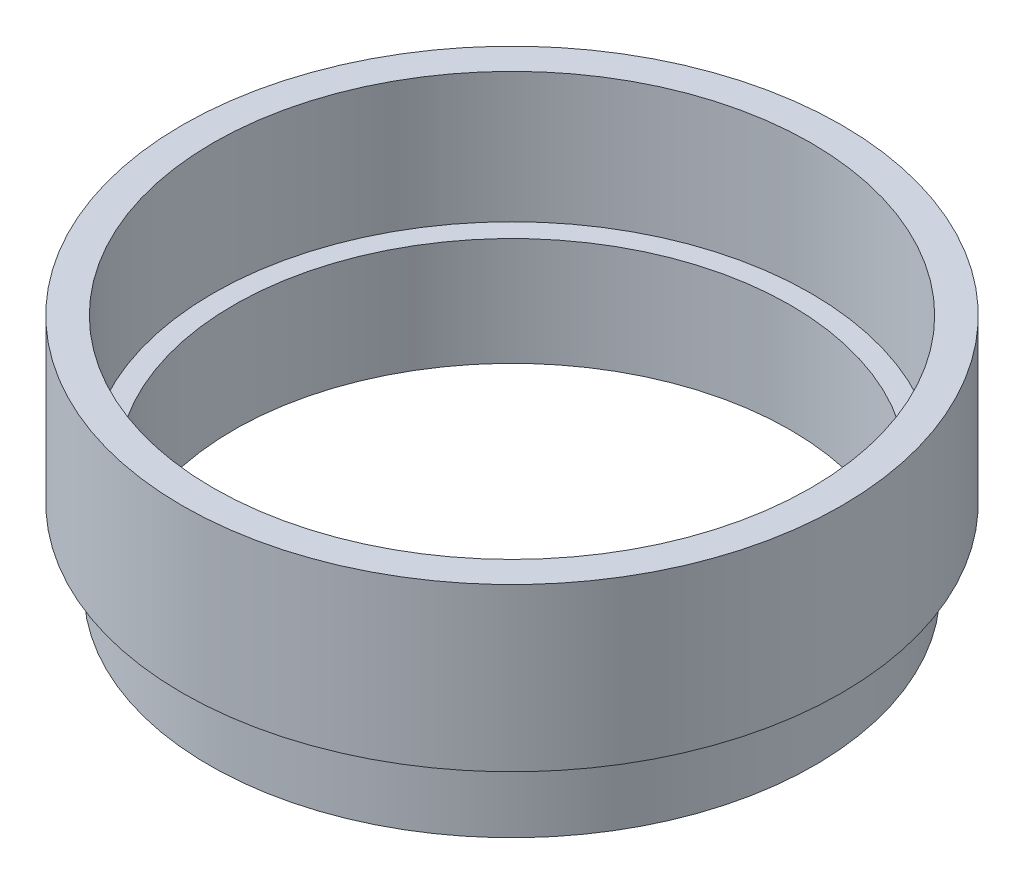
ISO-10303-21;
HEADER;
FILE_DESCRIPTION(('STEP AP214'),'2;1');
FILE_NAME('part.step','',(''),(''),'','','');
FILE_SCHEMA(('AUTOMOTIVE_DESIGN { 1 0 10303 214 1 1 1 1 }'));
ENDSEC;
DATA;
#1=APPLICATION_CONTEXT('core data for automotive mechanical design processes');
#2=APPLICATION_PROTOCOL_DEFINITION('international standard','automotive_design',2000,#1);
#3=PRODUCT_CONTEXT('',#1,'mechanical');
#4=PRODUCT('Part','Part','',(#3));
#5=PRODUCT_RELATED_PRODUCT_CATEGORY('part','',(#4));
#6=PRODUCT_DEFINITION_FORMATION('','',#4);
#7=PRODUCT_DEFINITION_CONTEXT('part definition',#1,'design');
#8=PRODUCT_DEFINITION('design','',#6,#7);
#9=PRODUCT_DEFINITION_SHAPE('','',#8);
#10=(LENGTH_UNIT() NAMED_UNIT(*) SI_UNIT(.MILLI.,.METRE.));
#11=(NAMED_UNIT(*) PLANE_ANGLE_UNIT() SI_UNIT($,.RADIAN.));
#12=(NAMED_UNIT(*) SI_UNIT($,.STERADIAN.) SOLID_ANGLE_UNIT());
#13=UNCERTAINTY_MEASURE_WITH_UNIT(LENGTH_MEASURE(1.E-05),#10,'distance_accuracy_value','');
#14=(GEOMETRIC_REPRESENTATION_CONTEXT(3) GLOBAL_UNCERTAINTY_ASSIGNED_CONTEXT((#13)) GLOBAL_UNIT_ASSIGNED_CONTEXT((#10,
#11,#12)) REPRESENTATION_CONTEXT('',''));
#15=CARTESIAN_POINT('',(0.,0.,0.));
#16=DIRECTION('',(0.,0.,1.));
#17=DIRECTION('',(1.,0.,0.));
#18=AXIS2_PLACEMENT_3D('',#15,#16,#17);
#19=CARTESIAN_POINT('',(0.,0.,0.));
#20=DIRECTION('',(0.,-1.,0.));
#21=DIRECTION('',(0.,0.,-1.));
#22=AXIS2_PLACEMENT_3D('',#19,#20,#21);
#23=CYLINDRICAL_SURFACE('',#22,13.081);
#24=CARTESIAN_POINT('',(0.,5.08,0.));
#25=DIRECTION('',(0.,-1.,0.));
#26=DIRECTION('',(0.,0.,-1.));
#27=AXIS2_PLACEMENT_3D('',#24,#25,#26);
#28=CIRCLE('',#27,13.081);
#29=CARTESIAN_POINT('',(0.,5.08,-13.081));
#30=VERTEX_POINT('',#29);
#31=EDGE_CURVE('E59',#30,#30,#28,.T.);
#32=ORIENTED_EDGE('',*,*,#31,.F.);
#33=EDGE_LOOP('',(#32));
#34=FACE_BOUND('',#33,.T.);
#35=CARTESIAN_POINT('',(0.,0.,0.));
#36=DIRECTION('',(0.,-1.,0.));
#37=DIRECTION('',(0.,0.,-1.));
#38=AXIS2_PLACEMENT_3D('',#35,#36,#37);
#39=CIRCLE('',#38,13.081);
#40=CARTESIAN_POINT('',(0.,0.,-13.081));
#41=VERTEX_POINT('',#40);
#42=EDGE_CURVE('E10',#41,#41,#39,.T.);
#43=ORIENTED_EDGE('',*,*,#42,.T.);
#44=EDGE_LOOP('',(#43));
#45=FACE_BOUND('',#44,.T.);
#46=ADVANCED_FACE('F31',(#34,#45),#23,.F.);
#47=CARTESIAN_POINT('',(-13.081,0.,0.));
#48=DIRECTION('',(0.,1.,0.));
#49=DIRECTION('',(0.,0.,1.));
#50=AXIS2_PLACEMENT_3D('',#47,#48,#49);
#51=PLANE('',#50);
#52=ORIENTED_EDGE('',*,*,#42,.F.);
#53=EDGE_LOOP('',(#52));
#54=FACE_BOUND('',#53,.T.);
#55=CARTESIAN_POINT('',(0.,0.,0.));
#56=DIRECTION('',(0.,-1.,0.));
#57=DIRECTION('',(0.,0.,-1.));
#58=AXIS2_PLACEMENT_3D('',#55,#56,#57);
#59=CIRCLE('',#58,14.224);
#60=CARTESIAN_POINT('',(0.,0.,-14.224));
#61=VERTEX_POINT('',#60);
#62=EDGE_CURVE('E37',#61,#61,#59,.T.);
#63=ORIENTED_EDGE('',*,*,#62,.T.);
#64=EDGE_LOOP('',(#63));
#65=FACE_BOUND('',#64,.T.);
#66=ADVANCED_FACE('F66',(#54,#65),#51,.F.);
#67=CARTESIAN_POINT('',(0.,0.,0.));
#68=DIRECTION('',(0.,-1.,0.));
#69=DIRECTION('',(0.,0.,-1.));
#70=AXIS2_PLACEMENT_3D('',#67,#68,#69);
#71=CYLINDRICAL_SURFACE('',#70,14.224);
#72=ORIENTED_EDGE('',*,*,#62,.F.);
#73=EDGE_LOOP('',(#72));
#74=FACE_BOUND('',#73,.T.);
#75=CARTESIAN_POINT('',(0.,3.5814,0.));
#76=DIRECTION('',(0.,-1.,0.));
#77=DIRECTION('',(0.,0.,-1.));
#78=AXIS2_PLACEMENT_3D('',#75,#76,#77);
#79=CIRCLE('',#78,14.224);
#80=CARTESIAN_POINT('',(0.,3.5814,-14.224));
#81=VERTEX_POINT('',#80);
#82=EDGE_CURVE('E41',#81,#81,#79,.T.);
#83=ORIENTED_EDGE('',*,*,#82,.T.);
#84=EDGE_LOOP('',(#83));
#85=FACE_BOUND('',#84,.T.);
#86=ADVANCED_FACE('F70',(#74,#85),#71,.T.);
#87=CARTESIAN_POINT('',(-14.224,3.5814,0.));
#88=DIRECTION('',(0.,1.,0.));
#89=DIRECTION('',(0.,0.,1.));
#90=AXIS2_PLACEMENT_3D('',#87,#88,#89);
#91=PLANE('',#90);
#92=ORIENTED_EDGE('',*,*,#82,.F.);
#93=EDGE_LOOP('',(#92));
#94=FACE_BOUND('',#93,.T.);
#95=CARTESIAN_POINT('',(0.,3.5814,0.));
#96=DIRECTION('',(0.,-1.,0.));
#97=DIRECTION('',(0.,0.,-1.));
#98=AXIS2_PLACEMENT_3D('',#95,#96,#97);
#99=CIRCLE('',#98,15.494);
#100=CARTESIAN_POINT('',(0.,3.5814,-15.494));
#101=VERTEX_POINT('',#100);
#102=EDGE_CURVE('E45',#101,#101,#99,.T.);
#103=ORIENTED_EDGE('',*,*,#102,.T.);
#104=EDGE_LOOP('',(#103));
#105=FACE_BOUND('',#104,.T.);
#106=ADVANCED_FACE('F75',(#94,#105),#91,.F.);
#107=CARTESIAN_POINT('',(0.,0.,0.));
#108=DIRECTION('',(0.,-1.,0.));
#109=DIRECTION('',(0.,0.,-1.));
#110=AXIS2_PLACEMENT_3D('',#107,#108,#109);
#111=CYLINDRICAL_SURFACE('',#110,15.494);
#112=ORIENTED_EDGE('',*,*,#102,.F.);
#113=EDGE_LOOP('',(#112));
#114=FACE_BOUND('',#113,.T.);
#115=CARTESIAN_POINT('',(0.,11.2014,0.));
#116=DIRECTION('',(0.,-1.,0.));
#117=DIRECTION('',(0.,0.,-1.));
#118=AXIS2_PLACEMENT_3D('',#115,#116,#117);
#119=CIRCLE('',#118,15.494);
#120=CARTESIAN_POINT('',(0.,11.2014,-15.494));
#121=VERTEX_POINT('',#120);
#122=EDGE_CURVE('E50',#121,#121,#119,.T.);
#123=ORIENTED_EDGE('',*,*,#122,.T.);
#124=EDGE_LOOP('',(#123));
#125=FACE_BOUND('',#124,.T.);
#126=ADVANCED_FACE('F81',(#114,#125),#111,.T.);
#127=CARTESIAN_POINT('',(-15.494,11.2014,0.));
#128=DIRECTION('',(0.,-1.,0.));
#129=DIRECTION('',(0.,0.,-1.));
#130=AXIS2_PLACEMENT_3D('',#127,#128,#129);
#131=PLANE('',#130);
#132=ORIENTED_EDGE('',*,*,#122,.F.);
#133=EDGE_LOOP('',(#132));
#134=FACE_BOUND('',#133,.T.);
#135=CARTESIAN_POINT('',(0.,11.2014,0.));
#136=DIRECTION('',(0.,-1.,0.));
#137=DIRECTION('',(0.,0.,-1.));
#138=AXIS2_PLACEMENT_3D('',#135,#136,#137);
#139=CIRCLE('',#138,14.0462);
#140=CARTESIAN_POINT('',(0.,11.2014,-14.0462));
#141=VERTEX_POINT('',#140);
#142=EDGE_CURVE('E53',#141,#141,#139,.T.);
#143=ORIENTED_EDGE('',*,*,#142,.T.);
#144=EDGE_LOOP('',(#143));
#145=FACE_BOUND('',#144,.T.);
#146=ADVANCED_FACE('F85',(#134,#145),#131,.F.);
#147=CARTESIAN_POINT('',(0.,0.,0.));
#148=DIRECTION('',(0.,-1.,0.));
#149=DIRECTION('',(0.,0.,-1.));
#150=AXIS2_PLACEMENT_3D('',#147,#148,#149);
#151=CYLINDRICAL_SURFACE('',#150,14.0462);
#152=ORIENTED_EDGE('',*,*,#142,.F.);
#153=EDGE_LOOP('',(#152));
#154=FACE_BOUND('',#153,.T.);
#155=CARTESIAN_POINT('',(0.,5.08,0.));
#156=DIRECTION('',(0.,-1.,0.));
#157=DIRECTION('',(0.,0.,-1.));
#158=AXIS2_PLACEMENT_3D('',#155,#156,#157);
#159=CIRCLE('',#158,14.0462);
#160=CARTESIAN_POINT('',(0.,5.08,-14.0462));
#161=VERTEX_POINT('',#160);
#162=EDGE_CURVE('E56',#161,#161,#159,.T.);
#163=ORIENTED_EDGE('',*,*,#162,.T.);
#164=EDGE_LOOP('',(#163));
#165=FACE_BOUND('',#164,.T.);
#166=ADVANCED_FACE('F89',(#154,#165),#151,.F.);
#167=CARTESIAN_POINT('',(-13.081,5.08,0.));
#168=DIRECTION('',(0.,-1.,0.));
#169=DIRECTION('',(0.,0.,-1.));
#170=AXIS2_PLACEMENT_3D('',#167,#168,#169);
#171=PLANE('',#170);
#172=ORIENTED_EDGE('',*,*,#162,.F.);
#173=EDGE_LOOP('',(#172));
#174=FACE_BOUND('',#173,.T.);
#175=ORIENTED_EDGE('',*,*,#31,.T.);
#176=EDGE_LOOP('',(#175));
#177=FACE_BOUND('',#176,.T.);
#178=ADVANCED_FACE('F63',(#174,#177),#171,.F.);
#179=CLOSED_SHELL('',(#46,#66,#86,#106,#126,#146,#166,#178));
#180=MANIFOLD_SOLID_BREP('B2',#179);
#181=ADVANCED_BREP_SHAPE_REPRESENTATION('',(#18,#180),#14);
#182=SHAPE_DEFINITION_REPRESENTATION(#9,#181);
ENDSEC;
END-ISO-10303-21;
